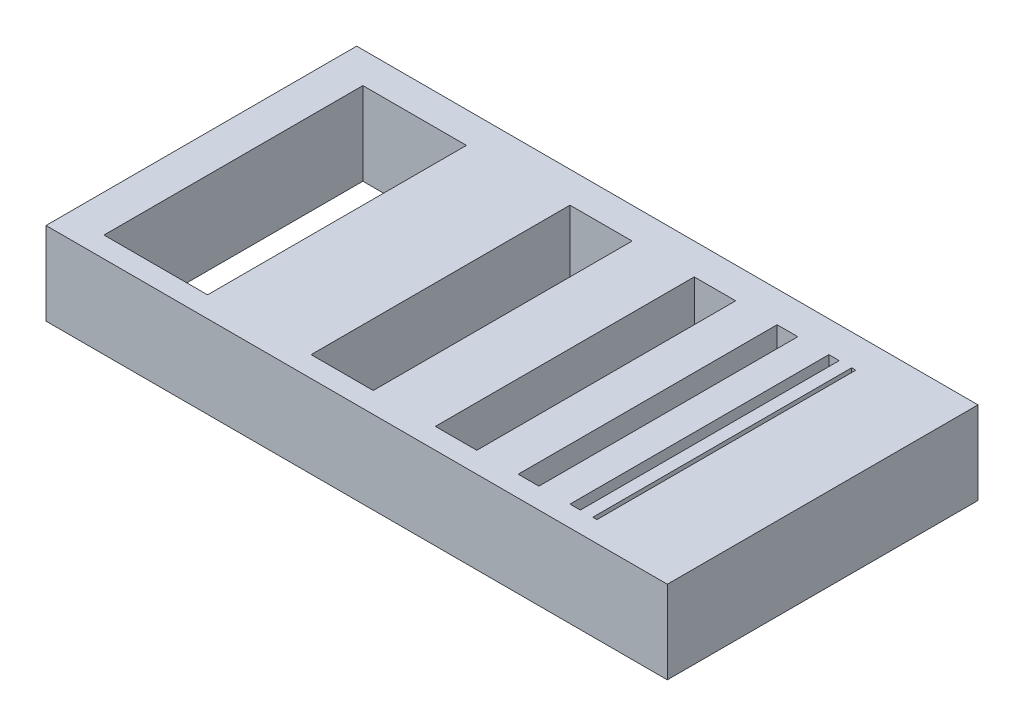
ISO-10303-21;
HEADER;
FILE_DESCRIPTION(('STEP AP214'),'2;1');
FILE_NAME('part.step','',(''),(''),'','','');
FILE_SCHEMA(('AUTOMOTIVE_DESIGN { 1 0 10303 214 1 1 1 1 }'));
ENDSEC;
DATA;
#1=APPLICATION_CONTEXT('core data for automotive mechanical design processes');
#2=APPLICATION_PROTOCOL_DEFINITION('international standard','automotive_design',2000,#1);
#3=PRODUCT_CONTEXT('',#1,'mechanical');
#4=PRODUCT('Part','Part','',(#3));
#5=PRODUCT_RELATED_PRODUCT_CATEGORY('part','',(#4));
#6=PRODUCT_DEFINITION_FORMATION('','',#4);
#7=PRODUCT_DEFINITION_CONTEXT('part definition',#1,'design');
#8=PRODUCT_DEFINITION('design','',#6,#7);
#9=PRODUCT_DEFINITION_SHAPE('','',#8);
#10=(LENGTH_UNIT() NAMED_UNIT(*) SI_UNIT(.MILLI.,.METRE.));
#11=(NAMED_UNIT(*) PLANE_ANGLE_UNIT() SI_UNIT($,.RADIAN.));
#12=(NAMED_UNIT(*) SI_UNIT($,.STERADIAN.) SOLID_ANGLE_UNIT());
#13=UNCERTAINTY_MEASURE_WITH_UNIT(LENGTH_MEASURE(1.E-05),#10,'distance_accuracy_value','');
#14=(GEOMETRIC_REPRESENTATION_CONTEXT(3) GLOBAL_UNCERTAINTY_ASSIGNED_CONTEXT((#13)) GLOBAL_UNIT_ASSIGNED_CONTEXT((#10,
#11,#12)) REPRESENTATION_CONTEXT('',''));
#15=CARTESIAN_POINT('',(0.,0.,0.));
#16=DIRECTION('',(0.,0.,1.));
#17=DIRECTION('',(1.,0.,0.));
#18=AXIS2_PLACEMENT_3D('',#15,#16,#17);
#19=CARTESIAN_POINT('',(0.,20.,0.));
#20=DIRECTION('',(0.,-1.,0.));
#21=DIRECTION('',(0.,0.,-1.));
#22=AXIS2_PLACEMENT_3D('',#19,#20,#21);
#23=PLANE('',#22);
#24=DIRECTION('',(0.,0.,1.));
#25=VECTOR('',#24,1.);
#26=CARTESIAN_POINT('',(121.5,20.,-67.5));
#27=LINE('',#26,#25);
#28=CARTESIAN_POINT('',(121.5,20.,-67.5));
#29=VERTEX_POINT('',#28);
#30=CARTESIAN_POINT('',(121.5,20.,-5.));
#31=VERTEX_POINT('',#30);
#32=EDGE_CURVE('E277',#29,#31,#27,.T.);
#33=ORIENTED_EDGE('',*,*,#32,.F.);
#34=DIRECTION('',(-1.,0.,0.));
#35=VECTOR('',#34,1.);
#36=CARTESIAN_POINT('',(121.5,20.,-67.5));
#37=LINE('',#36,#35);
#38=CARTESIAN_POINT('',(124.,20.,-67.5));
#39=VERTEX_POINT('',#38);
#40=EDGE_CURVE('E288',#39,#29,#37,.T.);
#41=ORIENTED_EDGE('',*,*,#40,.F.);
#42=DIRECTION('',(0.,0.,-1.));
#43=VECTOR('',#42,1.);
#44=CARTESIAN_POINT('',(124.,20.,-67.5));
#45=LINE('',#44,#43);
#46=CARTESIAN_POINT('',(124.,20.,-5.));
#47=VERTEX_POINT('',#46);
#48=EDGE_CURVE('E284',#47,#39,#45,.T.);
#49=ORIENTED_EDGE('',*,*,#48,.F.);
#50=DIRECTION('',(1.,0.,0.));
#51=VECTOR('',#50,1.);
#52=CARTESIAN_POINT('',(121.5,20.,-5.));
#53=LINE('',#52,#51);
#54=EDGE_CURVE('E280',#31,#47,#53,.T.);
#55=ORIENTED_EDGE('',*,*,#54,.F.);
#56=EDGE_LOOP('',(#33,#41,#49,#55));
#57=FACE_BOUND('',#56,.T.);
#58=DIRECTION('',(0.,0.,1.));
#59=VECTOR('',#58,1.);
#60=CARTESIAN_POINT('',(89.,20.,-67.5));
#61=LINE('',#60,#59);
#62=CARTESIAN_POINT('',(89.,20.,-67.5));
#63=VERTEX_POINT('',#62);
#64=CARTESIAN_POINT('',(89.,20.,-5.));
#65=VERTEX_POINT('',#64);
#66=EDGE_CURVE('E363',#63,#65,#61,.T.);
#67=ORIENTED_EDGE('',*,*,#66,.F.);
#68=DIRECTION('',(-1.,0.,0.));
#69=VECTOR('',#68,1.);
#70=CARTESIAN_POINT('',(89.,20.,-67.5));
#71=LINE('',#70,#69);
#72=CARTESIAN_POINT('',(99.,20.,-67.5));
#73=VERTEX_POINT('',#72);
#74=EDGE_CURVE('E374',#73,#63,#71,.T.);
#75=ORIENTED_EDGE('',*,*,#74,.F.);
#76=DIRECTION('',(0.,0.,-1.));
#77=VECTOR('',#76,1.);
#78=CARTESIAN_POINT('',(99.,20.,-67.5));
#79=LINE('',#78,#77);
#80=CARTESIAN_POINT('',(99.,20.,-5.));
#81=VERTEX_POINT('',#80);
#82=EDGE_CURVE('E370',#81,#73,#79,.T.);
#83=ORIENTED_EDGE('',*,*,#82,.F.);
#84=DIRECTION('',(1.,0.,0.));
#85=VECTOR('',#84,1.);
#86=CARTESIAN_POINT('',(89.,20.,-5.));
#87=LINE('',#86,#85);
#88=EDGE_CURVE('E366',#65,#81,#87,.T.);
#89=ORIENTED_EDGE('',*,*,#88,.F.);
#90=EDGE_LOOP('',(#67,#75,#83,#89));
#91=FACE_BOUND('',#90,.T.);
#92=DIRECTION('',(0.,0.,1.));
#93=VECTOR('',#92,1.);
#94=CARTESIAN_POINT('',(9.,20.,-67.5));
#95=LINE('',#94,#93);
#96=CARTESIAN_POINT('',(9.,20.,-67.5));
#97=VERTEX_POINT('',#96);
#98=CARTESIAN_POINT('',(9.00000000000001,20.,-5.));
#99=VERTEX_POINT('',#98);
#100=EDGE_CURVE('E449',#97,#99,#95,.T.);
#101=ORIENTED_EDGE('',*,*,#100,.F.);
#102=DIRECTION('',(-1.,0.,0.));
#103=VECTOR('',#102,1.);
#104=CARTESIAN_POINT('',(9.,20.,-67.5));
#105=LINE('',#104,#103);
#106=CARTESIAN_POINT('',(34.,20.,-67.5));
#107=VERTEX_POINT('',#106);
#108=EDGE_CURVE('E460',#107,#97,#105,.T.);
#109=ORIENTED_EDGE('',*,*,#108,.F.);
#110=DIRECTION('',(0.,0.,-1.));
#111=VECTOR('',#110,1.);
#112=CARTESIAN_POINT('',(34.,20.,-67.5));
#113=LINE('',#112,#111);
#114=CARTESIAN_POINT('',(34.,20.,-5.));
#115=VERTEX_POINT('',#114);
#116=EDGE_CURVE('E456',#115,#107,#113,.T.);
#117=ORIENTED_EDGE('',*,*,#116,.F.);
#118=DIRECTION('',(1.,0.,0.));
#119=VECTOR('',#118,1.);
#120=CARTESIAN_POINT('',(9.00000000000001,20.,-5.));
#121=LINE('',#120,#119);
#122=EDGE_CURVE('E452',#99,#115,#121,.T.);
#123=ORIENTED_EDGE('',*,*,#122,.F.);
#124=EDGE_LOOP('',(#101,#109,#117,#123));
#125=FACE_BOUND('',#124,.T.);
#126=DIRECTION('',(0.,0.,-1.));
#127=VECTOR('',#126,1.);
#128=CARTESIAN_POINT('',(150.,20.,0.));
#129=LINE('',#128,#127);
#130=CARTESIAN_POINT('',(150.,20.,0.));
#131=VERTEX_POINT('',#130);
#132=CARTESIAN_POINT('',(150.,20.,-75.));
#133=VERTEX_POINT('',#132);
#134=EDGE_CURVE('E492',#131,#133,#129,.T.);
#135=ORIENTED_EDGE('',*,*,#134,.T.);
#136=DIRECTION('',(-1.,0.,0.));
#137=VECTOR('',#136,1.);
#138=CARTESIAN_POINT('',(0.,20.,-75.));
#139=LINE('',#138,#137);
#140=CARTESIAN_POINT('',(0.,20.,-75.));
#141=VERTEX_POINT('',#140);
#142=EDGE_CURVE('E496',#133,#141,#139,.T.);
#143=ORIENTED_EDGE('',*,*,#142,.T.);
#144=DIRECTION('',(0.,0.,1.));
#145=VECTOR('',#144,1.);
#146=CARTESIAN_POINT('',(0.,20.,0.));
#147=LINE('',#146,#145);
#148=CARTESIAN_POINT('',(0.,20.,0.));
#149=VERTEX_POINT('',#148);
#150=EDGE_CURVE('E500',#141,#149,#147,.T.);
#151=ORIENTED_EDGE('',*,*,#150,.T.);
#152=DIRECTION('',(1.,0.,0.));
#153=VECTOR('',#152,1.);
#154=CARTESIAN_POINT('',(0.,20.,0.));
#155=LINE('',#154,#153);
#156=EDGE_CURVE('E503',#149,#131,#155,.T.);
#157=ORIENTED_EDGE('',*,*,#156,.T.);
#158=EDGE_LOOP('',(#135,#143,#151,#157));
#159=FACE_BOUND('',#158,.T.);
#160=DIRECTION('',(0.,0.,1.));
#161=VECTOR('',#160,1.);
#162=CARTESIAN_POINT('',(59.,20.,-67.5));
#163=LINE('',#162,#161);
#164=CARTESIAN_POINT('',(59.,20.,-67.5));
#165=VERTEX_POINT('',#164);
#166=CARTESIAN_POINT('',(59.,20.,-5.));
#167=VERTEX_POINT('',#166);
#168=EDGE_CURVE('E406',#165,#167,#163,.T.);
#169=ORIENTED_EDGE('',*,*,#168,.F.);
#170=DIRECTION('',(-1.,0.,0.));
#171=VECTOR('',#170,1.);
#172=CARTESIAN_POINT('',(59.,20.,-67.5));
#173=LINE('',#172,#171);
#174=CARTESIAN_POINT('',(74.,20.,-67.5));
#175=VERTEX_POINT('',#174);
#176=EDGE_CURVE('E417',#175,#165,#173,.T.);
#177=ORIENTED_EDGE('',*,*,#176,.F.);
#178=DIRECTION('',(0.,0.,-1.));
#179=VECTOR('',#178,1.);
#180=CARTESIAN_POINT('',(74.,20.,-67.5));
#181=LINE('',#180,#179);
#182=CARTESIAN_POINT('',(74.,20.,-5.));
#183=VERTEX_POINT('',#182);
#184=EDGE_CURVE('E413',#183,#175,#181,.T.);
#185=ORIENTED_EDGE('',*,*,#184,.F.);
#186=DIRECTION('',(1.,0.,0.));
#187=VECTOR('',#186,1.);
#188=CARTESIAN_POINT('',(59.,20.,-5.));
#189=LINE('',#188,#187);
#190=EDGE_CURVE('E409',#167,#183,#189,.T.);
#191=ORIENTED_EDGE('',*,*,#190,.F.);
#192=EDGE_LOOP('',(#169,#177,#185,#191));
#193=FACE_BOUND('',#192,.T.);
#194=DIRECTION('',(0.,0.,1.));
#195=VECTOR('',#194,1.);
#196=CARTESIAN_POINT('',(109.,20.,-67.5));
#197=LINE('',#196,#195);
#198=CARTESIAN_POINT('',(109.,20.,-67.5));
#199=VERTEX_POINT('',#198);
#200=CARTESIAN_POINT('',(109.,20.,-5.));
#201=VERTEX_POINT('',#200);
#202=EDGE_CURVE('E320',#199,#201,#197,.T.);
#203=ORIENTED_EDGE('',*,*,#202,.F.);
#204=DIRECTION('',(-1.,0.,0.));
#205=VECTOR('',#204,1.);
#206=CARTESIAN_POINT('',(109.,20.,-67.5));
#207=LINE('',#206,#205);
#208=CARTESIAN_POINT('',(114.,20.,-67.5));
#209=VERTEX_POINT('',#208);
#210=EDGE_CURVE('E331',#209,#199,#207,.T.);
#211=ORIENTED_EDGE('',*,*,#210,.F.);
#212=DIRECTION('',(0.,0.,-1.));
#213=VECTOR('',#212,1.);
#214=CARTESIAN_POINT('',(114.,20.,-67.5));
#215=LINE('',#214,#213);
#216=CARTESIAN_POINT('',(114.,20.,-5.));
#217=VERTEX_POINT('',#216);
#218=EDGE_CURVE('E327',#217,#209,#215,.T.);
#219=ORIENTED_EDGE('',*,*,#218,.F.);
#220=DIRECTION('',(1.,0.,0.));
#221=VECTOR('',#220,1.);
#222=CARTESIAN_POINT('',(109.,20.,-5.));
#223=LINE('',#222,#221);
#224=EDGE_CURVE('E323',#201,#217,#223,.T.);
#225=ORIENTED_EDGE('',*,*,#224,.F.);
#226=EDGE_LOOP('',(#203,#211,#219,#225));
#227=FACE_BOUND('',#226,.T.);
#228=DIRECTION('',(0.,0.,1.));
#229=VECTOR('',#228,1.);
#230=CARTESIAN_POINT('',(127.,20.,-67.5));
#231=LINE('',#230,#229);
#232=CARTESIAN_POINT('',(127.,20.,-67.5));
#233=VERTEX_POINT('',#232);
#234=CARTESIAN_POINT('',(127.,20.,-5.));
#235=VERTEX_POINT('',#234);
#236=EDGE_CURVE('E229',#233,#235,#231,.T.);
#237=ORIENTED_EDGE('',*,*,#236,.F.);
#238=DIRECTION('',(-1.,0.,0.));
#239=VECTOR('',#238,1.);
#240=CARTESIAN_POINT('',(127.,20.,-67.5));
#241=LINE('',#240,#239);
#242=CARTESIAN_POINT('',(128.,20.,-67.5));
#243=VERTEX_POINT('',#242);
#244=EDGE_CURVE('E255',#243,#233,#241,.T.);
#245=ORIENTED_EDGE('',*,*,#244,.F.);
#246=DIRECTION('',(0.,0.,-1.));
#247=VECTOR('',#246,1.);
#248=CARTESIAN_POINT('',(128.,20.,-67.5));
#249=LINE('',#248,#247);
#250=CARTESIAN_POINT('',(128.,20.,-5.));
#251=VERTEX_POINT('',#250);
#252=EDGE_CURVE('E251',#251,#243,#249,.T.);
#253=ORIENTED_EDGE('',*,*,#252,.F.);
#254=DIRECTION('',(1.,0.,0.));
#255=VECTOR('',#254,1.);
#256=CARTESIAN_POINT('',(127.,20.,-5.));
#257=LINE('',#256,#255);
#258=EDGE_CURVE('E238',#235,#251,#257,.T.);
#259=ORIENTED_EDGE('',*,*,#258,.F.);
#260=EDGE_LOOP('',(#237,#245,#253,#259));
#261=FACE_BOUND('',#260,.T.);
#262=ADVANCED_FACE('F43',(#57,#91,#125,#159,#193,#227,#261),#23,.F.);
#263=CARTESIAN_POINT('',(0.,0.,0.));
#264=DIRECTION('',(0.,-1.,0.));
#265=DIRECTION('',(0.,0.,-1.));
#266=AXIS2_PLACEMENT_3D('',#263,#264,#265);
#267=PLANE('',#266);
#268=DIRECTION('',(0.,0.,-1.));
#269=VECTOR('',#268,1.);
#270=CARTESIAN_POINT('',(150.,0.,0.));
#271=LINE('',#270,#269);
#272=CARTESIAN_POINT('',(150.,0.,0.));
#273=VERTEX_POINT('',#272);
#274=CARTESIAN_POINT('',(150.,0.,-75.));
#275=VERTEX_POINT('',#274);
#276=EDGE_CURVE('E491',#273,#275,#271,.T.);
#277=ORIENTED_EDGE('',*,*,#276,.F.);
#278=DIRECTION('',(1.,0.,0.));
#279=VECTOR('',#278,1.);
#280=CARTESIAN_POINT('',(0.,0.,0.));
#281=LINE('',#280,#279);
#282=CARTESIAN_POINT('',(0.,0.,0.));
#283=VERTEX_POINT('',#282);
#284=EDGE_CURVE('E497',#283,#273,#281,.T.);
#285=ORIENTED_EDGE('',*,*,#284,.F.);
#286=DIRECTION('',(0.,0.,1.));
#287=VECTOR('',#286,1.);
#288=CARTESIAN_POINT('',(0.,0.,0.));
#289=LINE('',#288,#287);
#290=CARTESIAN_POINT('',(0.,0.,-75.));
#291=VERTEX_POINT('',#290);
#292=EDGE_CURVE('E513',#291,#283,#289,.T.);
#293=ORIENTED_EDGE('',*,*,#292,.F.);
#294=DIRECTION('',(-1.,0.,0.));
#295=VECTOR('',#294,1.);
#296=CARTESIAN_POINT('',(0.,0.,-75.));
#297=LINE('',#296,#295);
#298=EDGE_CURVE('E510',#275,#291,#297,.T.);
#299=ORIENTED_EDGE('',*,*,#298,.F.);
#300=EDGE_LOOP('',(#277,#285,#293,#299));
#301=FACE_BOUND('',#300,.T.);
#302=DIRECTION('',(-1.,0.,0.));
#303=VECTOR('',#302,1.);
#304=CARTESIAN_POINT('',(9.,0.,-67.5));
#305=LINE('',#304,#303);
#306=CARTESIAN_POINT('',(34.,0.,-67.5));
#307=VERTEX_POINT('',#306);
#308=CARTESIAN_POINT('',(9.,0.,-67.5));
#309=VERTEX_POINT('',#308);
#310=EDGE_CURVE('E453',#307,#309,#305,.T.);
#311=ORIENTED_EDGE('',*,*,#310,.T.);
#312=DIRECTION('',(0.,0.,1.));
#313=VECTOR('',#312,1.);
#314=CARTESIAN_POINT('',(9.,0.,-67.5));
#315=LINE('',#314,#313);
#316=CARTESIAN_POINT('',(9.00000000000001,0.,-5.));
#317=VERTEX_POINT('',#316);
#318=EDGE_CURVE('E448',#309,#317,#315,.T.);
#319=ORIENTED_EDGE('',*,*,#318,.T.);
#320=DIRECTION('',(1.,0.,0.));
#321=VECTOR('',#320,1.);
#322=CARTESIAN_POINT('',(9.00000000000001,0.,-5.));
#323=LINE('',#322,#321);
#324=CARTESIAN_POINT('',(34.,0.,-5.));
#325=VERTEX_POINT('',#324);
#326=EDGE_CURVE('E467',#317,#325,#323,.T.);
#327=ORIENTED_EDGE('',*,*,#326,.T.);
#328=DIRECTION('',(0.,0.,-1.));
#329=VECTOR('',#328,1.);
#330=CARTESIAN_POINT('',(34.,0.,-67.5));
#331=LINE('',#330,#329);
#332=EDGE_CURVE('E471',#325,#307,#331,.T.);
#333=ORIENTED_EDGE('',*,*,#332,.T.);
#334=EDGE_LOOP('',(#311,#319,#327,#333));
#335=FACE_BOUND('',#334,.T.);
#336=DIRECTION('',(-1.,0.,0.));
#337=VECTOR('',#336,1.);
#338=CARTESIAN_POINT('',(59.,0.,-67.5));
#339=LINE('',#338,#337);
#340=CARTESIAN_POINT('',(74.,0.,-67.5));
#341=VERTEX_POINT('',#340);
#342=CARTESIAN_POINT('',(59.,0.,-67.5));
#343=VERTEX_POINT('',#342);
#344=EDGE_CURVE('E410',#341,#343,#339,.T.);
#345=ORIENTED_EDGE('',*,*,#344,.T.);
#346=DIRECTION('',(0.,0.,1.));
#347=VECTOR('',#346,1.);
#348=CARTESIAN_POINT('',(59.,0.,-67.5));
#349=LINE('',#348,#347);
#350=CARTESIAN_POINT('',(59.,0.,-5.));
#351=VERTEX_POINT('',#350);
#352=EDGE_CURVE('E405',#343,#351,#349,.T.);
#353=ORIENTED_EDGE('',*,*,#352,.T.);
#354=DIRECTION('',(1.,0.,0.));
#355=VECTOR('',#354,1.);
#356=CARTESIAN_POINT('',(59.,0.,-5.));
#357=LINE('',#356,#355);
#358=CARTESIAN_POINT('',(74.,0.,-5.));
#359=VERTEX_POINT('',#358);
#360=EDGE_CURVE('E424',#351,#359,#357,.T.);
#361=ORIENTED_EDGE('',*,*,#360,.T.);
#362=DIRECTION('',(0.,0.,-1.));
#363=VECTOR('',#362,1.);
#364=CARTESIAN_POINT('',(74.,0.,-67.5));
#365=LINE('',#364,#363);
#366=EDGE_CURVE('E428',#359,#341,#365,.T.);
#367=ORIENTED_EDGE('',*,*,#366,.T.);
#368=EDGE_LOOP('',(#345,#353,#361,#367));
#369=FACE_BOUND('',#368,.T.);
#370=DIRECTION('',(-1.,0.,0.));
#371=VECTOR('',#370,1.);
#372=CARTESIAN_POINT('',(89.,0.,-67.5));
#373=LINE('',#372,#371);
#374=CARTESIAN_POINT('',(99.,0.,-67.5));
#375=VERTEX_POINT('',#374);
#376=CARTESIAN_POINT('',(89.,0.,-67.5));
#377=VERTEX_POINT('',#376);
#378=EDGE_CURVE('E367',#375,#377,#373,.T.);
#379=ORIENTED_EDGE('',*,*,#378,.T.);
#380=DIRECTION('',(0.,0.,1.));
#381=VECTOR('',#380,1.);
#382=CARTESIAN_POINT('',(89.,0.,-67.5));
#383=LINE('',#382,#381);
#384=CARTESIAN_POINT('',(89.,0.,-5.));
#385=VERTEX_POINT('',#384);
#386=EDGE_CURVE('E362',#377,#385,#383,.T.);
#387=ORIENTED_EDGE('',*,*,#386,.T.);
#388=DIRECTION('',(1.,0.,0.));
#389=VECTOR('',#388,1.);
#390=CARTESIAN_POINT('',(89.,0.,-5.));
#391=LINE('',#390,#389);
#392=CARTESIAN_POINT('',(99.,0.,-5.));
#393=VERTEX_POINT('',#392);
#394=EDGE_CURVE('E381',#385,#393,#391,.T.);
#395=ORIENTED_EDGE('',*,*,#394,.T.);
#396=DIRECTION('',(0.,0.,-1.));
#397=VECTOR('',#396,1.);
#398=CARTESIAN_POINT('',(99.,0.,-67.5));
#399=LINE('',#398,#397);
#400=EDGE_CURVE('E385',#393,#375,#399,.T.);
#401=ORIENTED_EDGE('',*,*,#400,.T.);
#402=EDGE_LOOP('',(#379,#387,#395,#401));
#403=FACE_BOUND('',#402,.T.);
#404=DIRECTION('',(-1.,0.,0.));
#405=VECTOR('',#404,1.);
#406=CARTESIAN_POINT('',(109.,0.,-67.5));
#407=LINE('',#406,#405);
#408=CARTESIAN_POINT('',(114.,0.,-67.5));
#409=VERTEX_POINT('',#408);
#410=CARTESIAN_POINT('',(109.,0.,-67.5));
#411=VERTEX_POINT('',#410);
#412=EDGE_CURVE('E324',#409,#411,#407,.T.);
#413=ORIENTED_EDGE('',*,*,#412,.T.);
#414=DIRECTION('',(0.,0.,1.));
#415=VECTOR('',#414,1.);
#416=CARTESIAN_POINT('',(109.,0.,-67.5));
#417=LINE('',#416,#415);
#418=CARTESIAN_POINT('',(109.,0.,-5.));
#419=VERTEX_POINT('',#418);
#420=EDGE_CURVE('E319',#411,#419,#417,.T.);
#421=ORIENTED_EDGE('',*,*,#420,.T.);
#422=DIRECTION('',(1.,0.,0.));
#423=VECTOR('',#422,1.);
#424=CARTESIAN_POINT('',(109.,0.,-5.));
#425=LINE('',#424,#423);
#426=CARTESIAN_POINT('',(114.,0.,-5.));
#427=VERTEX_POINT('',#426);
#428=EDGE_CURVE('E338',#419,#427,#425,.T.);
#429=ORIENTED_EDGE('',*,*,#428,.T.);
#430=DIRECTION('',(0.,0.,-1.));
#431=VECTOR('',#430,1.);
#432=CARTESIAN_POINT('',(114.,0.,-67.5));
#433=LINE('',#432,#431);
#434=EDGE_CURVE('E342',#427,#409,#433,.T.);
#435=ORIENTED_EDGE('',*,*,#434,.T.);
#436=EDGE_LOOP('',(#413,#421,#429,#435));
#437=FACE_BOUND('',#436,.T.);
#438=DIRECTION('',(-1.,0.,0.));
#439=VECTOR('',#438,1.);
#440=CARTESIAN_POINT('',(121.5,0.,-67.5));
#441=LINE('',#440,#439);
#442=CARTESIAN_POINT('',(124.,0.,-67.5));
#443=VERTEX_POINT('',#442);
#444=CARTESIAN_POINT('',(121.5,0.,-67.5));
#445=VERTEX_POINT('',#444);
#446=EDGE_CURVE('E281',#443,#445,#441,.T.);
#447=ORIENTED_EDGE('',*,*,#446,.T.);
#448=DIRECTION('',(0.,0.,1.));
#449=VECTOR('',#448,1.);
#450=CARTESIAN_POINT('',(121.5,0.,-67.5));
#451=LINE('',#450,#449);
#452=CARTESIAN_POINT('',(121.5,0.,-5.));
#453=VERTEX_POINT('',#452);
#454=EDGE_CURVE('E247',#445,#453,#451,.T.);
#455=ORIENTED_EDGE('',*,*,#454,.T.);
#456=DIRECTION('',(1.,0.,0.));
#457=VECTOR('',#456,1.);
#458=CARTESIAN_POINT('',(121.5,0.,-5.));
#459=LINE('',#458,#457);
#460=CARTESIAN_POINT('',(124.,0.,-5.));
#461=VERTEX_POINT('',#460);
#462=EDGE_CURVE('E295',#453,#461,#459,.T.);
#463=ORIENTED_EDGE('',*,*,#462,.T.);
#464=DIRECTION('',(0.,0.,-1.));
#465=VECTOR('',#464,1.);
#466=CARTESIAN_POINT('',(124.,0.,-67.5));
#467=LINE('',#466,#465);
#468=EDGE_CURVE('E299',#461,#443,#467,.T.);
#469=ORIENTED_EDGE('',*,*,#468,.T.);
#470=EDGE_LOOP('',(#447,#455,#463,#469));
#471=FACE_BOUND('',#470,.T.);
#472=DIRECTION('',(-1.,0.,0.));
#473=VECTOR('',#472,1.);
#474=CARTESIAN_POINT('',(127.,0.,-67.5));
#475=LINE('',#474,#473);
#476=CARTESIAN_POINT('',(128.,0.,-67.5));
#477=VERTEX_POINT('',#476);
#478=CARTESIAN_POINT('',(127.,0.,-67.5));
#479=VERTEX_POINT('',#478);
#480=EDGE_CURVE('E239',#477,#479,#475,.T.);
#481=ORIENTED_EDGE('',*,*,#480,.T.);
#482=DIRECTION('',(0.,0.,1.));
#483=VECTOR('',#482,1.);
#484=CARTESIAN_POINT('',(127.,0.,-67.5));
#485=LINE('',#484,#483);
#486=CARTESIAN_POINT('',(127.,0.,-5.));
#487=VERTEX_POINT('',#486);
#488=EDGE_CURVE('E67',#479,#487,#485,.T.);
#489=ORIENTED_EDGE('',*,*,#488,.T.);
#490=DIRECTION('',(1.,0.,0.));
#491=VECTOR('',#490,1.);
#492=CARTESIAN_POINT('',(127.,0.,-5.));
#493=LINE('',#492,#491);
#494=CARTESIAN_POINT('',(128.,0.,-5.));
#495=VERTEX_POINT('',#494);
#496=EDGE_CURVE('E245',#487,#495,#493,.T.);
#497=ORIENTED_EDGE('',*,*,#496,.T.);
#498=DIRECTION('',(0.,0.,-1.));
#499=VECTOR('',#498,1.);
#500=CARTESIAN_POINT('',(128.,0.,-67.5));
#501=LINE('',#500,#499);
#502=EDGE_CURVE('E264',#495,#477,#501,.T.);
#503=ORIENTED_EDGE('',*,*,#502,.T.);
#504=EDGE_LOOP('',(#481,#489,#497,#503));
#505=FACE_BOUND('',#504,.T.);
#506=ADVANCED_FACE('F536',(#301,#335,#369,#403,#437,#471,#505),#267,.T.);
#507=CARTESIAN_POINT('',(150.,20.,0.));
#508=DIRECTION('',(-1.,0.,0.));
#509=DIRECTION('',(0.,0.,1.));
#510=AXIS2_PLACEMENT_3D('',#507,#508,#509);
#511=PLANE('',#510);
#512=ORIENTED_EDGE('',*,*,#276,.T.);
#513=DIRECTION('',(0.,-1.,0.));
#514=VECTOR('',#513,1.);
#515=CARTESIAN_POINT('',(150.,20.,-75.));
#516=LINE('',#515,#514);
#517=EDGE_CURVE('E11',#133,#275,#516,.T.);
#518=ORIENTED_EDGE('',*,*,#517,.F.);
#519=ORIENTED_EDGE('',*,*,#134,.F.);
#520=DIRECTION('',(0.,-1.,0.));
#521=VECTOR('',#520,1.);
#522=CARTESIAN_POINT('',(150.,20.,0.));
#523=LINE('',#522,#521);
#524=EDGE_CURVE('E506',#131,#273,#523,.T.);
#525=ORIENTED_EDGE('',*,*,#524,.T.);
#526=EDGE_LOOP('',(#512,#518,#519,#525));
#527=FACE_BOUND('',#526,.T.);
#528=ADVANCED_FACE('F45',(#527),#511,.F.);
#529=CARTESIAN_POINT('',(0.,20.,-75.));
#530=DIRECTION('',(0.,0.,1.));
#531=DIRECTION('',(1.,0.,0.));
#532=AXIS2_PLACEMENT_3D('',#529,#530,#531);
#533=PLANE('',#532);
#534=ORIENTED_EDGE('',*,*,#298,.T.);
#535=DIRECTION('',(0.,-1.,0.));
#536=VECTOR('',#535,1.);
#537=CARTESIAN_POINT('',(0.,20.,-75.));
#538=LINE('',#537,#536);
#539=EDGE_CURVE('E52',#141,#291,#538,.T.);
#540=ORIENTED_EDGE('',*,*,#539,.F.);
#541=ORIENTED_EDGE('',*,*,#142,.F.);
#542=ORIENTED_EDGE('',*,*,#517,.T.);
#543=EDGE_LOOP('',(#534,#540,#541,#542));
#544=FACE_BOUND('',#543,.T.);
#545=ADVANCED_FACE('F547',(#544),#533,.F.);
#546=CARTESIAN_POINT('',(0.,20.,0.));
#547=DIRECTION('',(1.,0.,0.));
#548=DIRECTION('',(0.,0.,-1.));
#549=AXIS2_PLACEMENT_3D('',#546,#547,#548);
#550=PLANE('',#549);
#551=ORIENTED_EDGE('',*,*,#292,.T.);
#552=DIRECTION('',(0.,-1.,0.));
#553=VECTOR('',#552,1.);
#554=CARTESIAN_POINT('',(0.,20.,0.));
#555=LINE('',#554,#553);
#556=EDGE_CURVE('E521',#149,#283,#555,.T.);
#557=ORIENTED_EDGE('',*,*,#556,.F.);
#558=ORIENTED_EDGE('',*,*,#150,.F.);
#559=ORIENTED_EDGE('',*,*,#539,.T.);
#560=EDGE_LOOP('',(#551,#557,#558,#559));
#561=FACE_BOUND('',#560,.T.);
#562=ADVANCED_FACE('F530',(#561),#550,.F.);
#563=CARTESIAN_POINT('',(0.,20.,0.));
#564=DIRECTION('',(0.,0.,-1.));
#565=DIRECTION('',(-1.,0.,0.));
#566=AXIS2_PLACEMENT_3D('',#563,#564,#565);
#567=PLANE('',#566);
#568=ORIENTED_EDGE('',*,*,#284,.T.);
#569=ORIENTED_EDGE('',*,*,#524,.F.);
#570=ORIENTED_EDGE('',*,*,#156,.F.);
#571=ORIENTED_EDGE('',*,*,#556,.T.);
#572=EDGE_LOOP('',(#568,#569,#570,#571));
#573=FACE_BOUND('',#572,.T.);
#574=ADVANCED_FACE('F540',(#573),#567,.F.);
#575=CARTESIAN_POINT('',(9.,20.,-67.5));
#576=DIRECTION('',(1.,0.,0.));
#577=DIRECTION('',(0.,0.,-1.));
#578=AXIS2_PLACEMENT_3D('',#575,#576,#577);
#579=PLANE('',#578);
#580=ORIENTED_EDGE('',*,*,#318,.F.);
#581=DIRECTION('',(0.,-1.,0.));
#582=VECTOR('',#581,1.);
#583=CARTESIAN_POINT('',(9.,20.,-67.5));
#584=LINE('',#583,#582);
#585=EDGE_CURVE('E463',#97,#309,#584,.T.);
#586=ORIENTED_EDGE('',*,*,#585,.F.);
#587=ORIENTED_EDGE('',*,*,#100,.T.);
#588=DIRECTION('',(0.,-1.,0.));
#589=VECTOR('',#588,1.);
#590=CARTESIAN_POINT('',(9.00000000000001,20.,-5.));
#591=LINE('',#590,#589);
#592=EDGE_CURVE('E487',#99,#317,#591,.T.);
#593=ORIENTED_EDGE('',*,*,#592,.T.);
#594=EDGE_LOOP('',(#580,#586,#587,#593));
#595=FACE_BOUND('',#594,.T.);
#596=ADVANCED_FACE('F564',(#595),#579,.T.);
#597=CARTESIAN_POINT('',(9.00000000000001,20.,-5.));
#598=DIRECTION('',(0.,0.,-1.));
#599=DIRECTION('',(-1.,0.,0.));
#600=AXIS2_PLACEMENT_3D('',#597,#598,#599);
#601=PLANE('',#600);
#602=ORIENTED_EDGE('',*,*,#326,.F.);
#603=ORIENTED_EDGE('',*,*,#592,.F.);
#604=ORIENTED_EDGE('',*,*,#122,.T.);
#605=DIRECTION('',(0.,-1.,0.));
#606=VECTOR('',#605,1.);
#607=CARTESIAN_POINT('',(34.,20.,-5.));
#608=LINE('',#607,#606);
#609=EDGE_CURVE('E484',#115,#325,#608,.T.);
#610=ORIENTED_EDGE('',*,*,#609,.T.);
#611=EDGE_LOOP('',(#602,#603,#604,#610));
#612=FACE_BOUND('',#611,.T.);
#613=ADVANCED_FACE('F571',(#612),#601,.T.);
#614=CARTESIAN_POINT('',(34.,20.,-67.5));
#615=DIRECTION('',(-1.,0.,0.));
#616=DIRECTION('',(0.,0.,1.));
#617=AXIS2_PLACEMENT_3D('',#614,#615,#616);
#618=PLANE('',#617);
#619=ORIENTED_EDGE('',*,*,#332,.F.);
#620=ORIENTED_EDGE('',*,*,#609,.F.);
#621=ORIENTED_EDGE('',*,*,#116,.T.);
#622=DIRECTION('',(0.,-1.,0.));
#623=VECTOR('',#622,1.);
#624=CARTESIAN_POINT('',(34.,20.,-67.5));
#625=LINE('',#624,#623);
#626=EDGE_CURVE('E481',#107,#307,#625,.T.);
#627=ORIENTED_EDGE('',*,*,#626,.T.);
#628=EDGE_LOOP('',(#619,#620,#621,#627));
#629=FACE_BOUND('',#628,.T.);
#630=ADVANCED_FACE('F576',(#629),#618,.T.);
#631=CARTESIAN_POINT('',(9.,20.,-67.5));
#632=DIRECTION('',(0.,0.,1.));
#633=DIRECTION('',(1.,0.,0.));
#634=AXIS2_PLACEMENT_3D('',#631,#632,#633);
#635=PLANE('',#634);
#636=ORIENTED_EDGE('',*,*,#310,.F.);
#637=ORIENTED_EDGE('',*,*,#626,.F.);
#638=ORIENTED_EDGE('',*,*,#108,.T.);
#639=ORIENTED_EDGE('',*,*,#585,.T.);
#640=EDGE_LOOP('',(#636,#637,#638,#639));
#641=FACE_BOUND('',#640,.T.);
#642=ADVANCED_FACE('F583',(#641),#635,.T.);
#643=CARTESIAN_POINT('',(59.,20.,-67.5));
#644=DIRECTION('',(1.,0.,0.));
#645=DIRECTION('',(0.,0.,-1.));
#646=AXIS2_PLACEMENT_3D('',#643,#644,#645);
#647=PLANE('',#646);
#648=ORIENTED_EDGE('',*,*,#352,.F.);
#649=DIRECTION('',(0.,-1.,0.));
#650=VECTOR('',#649,1.);
#651=CARTESIAN_POINT('',(59.,20.,-67.5));
#652=LINE('',#651,#650);
#653=EDGE_CURVE('E420',#165,#343,#652,.T.);
#654=ORIENTED_EDGE('',*,*,#653,.F.);
#655=ORIENTED_EDGE('',*,*,#168,.T.);
#656=DIRECTION('',(0.,-1.,0.));
#657=VECTOR('',#656,1.);
#658=CARTESIAN_POINT('',(59.,20.,-5.));
#659=LINE('',#658,#657);
#660=EDGE_CURVE('E444',#167,#351,#659,.T.);
#661=ORIENTED_EDGE('',*,*,#660,.T.);
#662=EDGE_LOOP('',(#648,#654,#655,#661));
#663=FACE_BOUND('',#662,.T.);
#664=ADVANCED_FACE('F597',(#663),#647,.T.);
#665=CARTESIAN_POINT('',(59.,20.,-5.));
#666=DIRECTION('',(0.,0.,-1.));
#667=DIRECTION('',(-1.,0.,0.));
#668=AXIS2_PLACEMENT_3D('',#665,#666,#667);
#669=PLANE('',#668);
#670=ORIENTED_EDGE('',*,*,#360,.F.);
#671=ORIENTED_EDGE('',*,*,#660,.F.);
#672=ORIENTED_EDGE('',*,*,#190,.T.);
#673=DIRECTION('',(0.,-1.,0.));
#674=VECTOR('',#673,1.);
#675=CARTESIAN_POINT('',(74.,20.,-5.));
#676=LINE('',#675,#674);
#677=EDGE_CURVE('E441',#183,#359,#676,.T.);
#678=ORIENTED_EDGE('',*,*,#677,.T.);
#679=EDGE_LOOP('',(#670,#671,#672,#678));
#680=FACE_BOUND('',#679,.T.);
#681=ADVANCED_FACE('F602',(#680),#669,.T.);
#682=CARTESIAN_POINT('',(74.,20.,-67.5));
#683=DIRECTION('',(-1.,0.,0.));
#684=DIRECTION('',(0.,0.,1.));
#685=AXIS2_PLACEMENT_3D('',#682,#683,#684);
#686=PLANE('',#685);
#687=ORIENTED_EDGE('',*,*,#366,.F.);
#688=ORIENTED_EDGE('',*,*,#677,.F.);
#689=ORIENTED_EDGE('',*,*,#184,.T.);
#690=DIRECTION('',(0.,-1.,0.));
#691=VECTOR('',#690,1.);
#692=CARTESIAN_POINT('',(74.,20.,-67.5));
#693=LINE('',#692,#691);
#694=EDGE_CURVE('E438',#175,#341,#693,.T.);
#695=ORIENTED_EDGE('',*,*,#694,.T.);
#696=EDGE_LOOP('',(#687,#688,#689,#695));
#697=FACE_BOUND('',#696,.T.);
#698=ADVANCED_FACE('F606',(#697),#686,.T.);
#699=CARTESIAN_POINT('',(59.,20.,-67.5));
#700=DIRECTION('',(0.,0.,1.));
#701=DIRECTION('',(1.,0.,0.));
#702=AXIS2_PLACEMENT_3D('',#699,#700,#701);
#703=PLANE('',#702);
#704=ORIENTED_EDGE('',*,*,#344,.F.);
#705=ORIENTED_EDGE('',*,*,#694,.F.);
#706=ORIENTED_EDGE('',*,*,#176,.T.);
#707=ORIENTED_EDGE('',*,*,#653,.T.);
#708=EDGE_LOOP('',(#704,#705,#706,#707));
#709=FACE_BOUND('',#708,.T.);
#710=ADVANCED_FACE('F610',(#709),#703,.T.);
#711=CARTESIAN_POINT('',(89.,20.,-67.5));
#712=DIRECTION('',(1.,0.,0.));
#713=DIRECTION('',(0.,0.,-1.));
#714=AXIS2_PLACEMENT_3D('',#711,#712,#713);
#715=PLANE('',#714);
#716=ORIENTED_EDGE('',*,*,#386,.F.);
#717=DIRECTION('',(0.,-1.,0.));
#718=VECTOR('',#717,1.);
#719=CARTESIAN_POINT('',(89.,20.,-67.5));
#720=LINE('',#719,#718);
#721=EDGE_CURVE('E377',#63,#377,#720,.T.);
#722=ORIENTED_EDGE('',*,*,#721,.F.);
#723=ORIENTED_EDGE('',*,*,#66,.T.);
#724=DIRECTION('',(0.,-1.,0.));
#725=VECTOR('',#724,1.);
#726=CARTESIAN_POINT('',(89.,20.,-5.));
#727=LINE('',#726,#725);
#728=EDGE_CURVE('E401',#65,#385,#727,.T.);
#729=ORIENTED_EDGE('',*,*,#728,.T.);
#730=EDGE_LOOP('',(#716,#722,#723,#729));
#731=FACE_BOUND('',#730,.T.);
#732=ADVANCED_FACE('F614',(#731),#715,.T.);
#733=CARTESIAN_POINT('',(89.,20.,-5.));
#734=DIRECTION('',(0.,0.,-1.));
#735=DIRECTION('',(-1.,0.,0.));
#736=AXIS2_PLACEMENT_3D('',#733,#734,#735);
#737=PLANE('',#736);
#738=ORIENTED_EDGE('',*,*,#394,.F.);
#739=ORIENTED_EDGE('',*,*,#728,.F.);
#740=ORIENTED_EDGE('',*,*,#88,.T.);
#741=DIRECTION('',(0.,-1.,0.));
#742=VECTOR('',#741,1.);
#743=CARTESIAN_POINT('',(99.,20.,-5.));
#744=LINE('',#743,#742);
#745=EDGE_CURVE('E398',#81,#393,#744,.T.);
#746=ORIENTED_EDGE('',*,*,#745,.T.);
#747=EDGE_LOOP('',(#738,#739,#740,#746));
#748=FACE_BOUND('',#747,.T.);
#749=ADVANCED_FACE('F618',(#748),#737,.T.);
#750=CARTESIAN_POINT('',(99.,20.,-67.5));
#751=DIRECTION('',(-1.,0.,0.));
#752=DIRECTION('',(0.,0.,1.));
#753=AXIS2_PLACEMENT_3D('',#750,#751,#752);
#754=PLANE('',#753);
#755=ORIENTED_EDGE('',*,*,#400,.F.);
#756=ORIENTED_EDGE('',*,*,#745,.F.);
#757=ORIENTED_EDGE('',*,*,#82,.T.);
#758=DIRECTION('',(0.,-1.,0.));
#759=VECTOR('',#758,1.);
#760=CARTESIAN_POINT('',(99.,20.,-67.5));
#761=LINE('',#760,#759);
#762=EDGE_CURVE('E395',#73,#375,#761,.T.);
#763=ORIENTED_EDGE('',*,*,#762,.T.);
#764=EDGE_LOOP('',(#755,#756,#757,#763));
#765=FACE_BOUND('',#764,.T.);
#766=ADVANCED_FACE('F622',(#765),#754,.T.);
#767=CARTESIAN_POINT('',(89.,20.,-67.5));
#768=DIRECTION('',(0.,0.,1.));
#769=DIRECTION('',(1.,0.,0.));
#770=AXIS2_PLACEMENT_3D('',#767,#768,#769);
#771=PLANE('',#770);
#772=ORIENTED_EDGE('',*,*,#378,.F.);
#773=ORIENTED_EDGE('',*,*,#762,.F.);
#774=ORIENTED_EDGE('',*,*,#74,.T.);
#775=ORIENTED_EDGE('',*,*,#721,.T.);
#776=EDGE_LOOP('',(#772,#773,#774,#775));
#777=FACE_BOUND('',#776,.T.);
#778=ADVANCED_FACE('F626',(#777),#771,.T.);
#779=CARTESIAN_POINT('',(109.,20.,-67.5));
#780=DIRECTION('',(1.,0.,0.));
#781=DIRECTION('',(0.,0.,-1.));
#782=AXIS2_PLACEMENT_3D('',#779,#780,#781);
#783=PLANE('',#782);
#784=ORIENTED_EDGE('',*,*,#420,.F.);
#785=DIRECTION('',(0.,-1.,0.));
#786=VECTOR('',#785,1.);
#787=CARTESIAN_POINT('',(109.,20.,-67.5));
#788=LINE('',#787,#786);
#789=EDGE_CURVE('E334',#199,#411,#788,.T.);
#790=ORIENTED_EDGE('',*,*,#789,.F.);
#791=ORIENTED_EDGE('',*,*,#202,.T.);
#792=DIRECTION('',(0.,-1.,0.));
#793=VECTOR('',#792,1.);
#794=CARTESIAN_POINT('',(109.,20.,-5.));
#795=LINE('',#794,#793);
#796=EDGE_CURVE('E358',#201,#419,#795,.T.);
#797=ORIENTED_EDGE('',*,*,#796,.T.);
#798=EDGE_LOOP('',(#784,#790,#791,#797));
#799=FACE_BOUND('',#798,.T.);
#800=ADVANCED_FACE('F630',(#799),#783,.T.);
#801=CARTESIAN_POINT('',(109.,20.,-5.));
#802=DIRECTION('',(0.,0.,-1.));
#803=DIRECTION('',(-1.,0.,0.));
#804=AXIS2_PLACEMENT_3D('',#801,#802,#803);
#805=PLANE('',#804);
#806=ORIENTED_EDGE('',*,*,#428,.F.);
#807=ORIENTED_EDGE('',*,*,#796,.F.);
#808=ORIENTED_EDGE('',*,*,#224,.T.);
#809=DIRECTION('',(0.,-1.,0.));
#810=VECTOR('',#809,1.);
#811=CARTESIAN_POINT('',(114.,20.,-5.));
#812=LINE('',#811,#810);
#813=EDGE_CURVE('E355',#217,#427,#812,.T.);
#814=ORIENTED_EDGE('',*,*,#813,.T.);
#815=EDGE_LOOP('',(#806,#807,#808,#814));
#816=FACE_BOUND('',#815,.T.);
#817=ADVANCED_FACE('F634',(#816),#805,.T.);
#818=CARTESIAN_POINT('',(114.,20.,-67.5));
#819=DIRECTION('',(-1.,0.,0.));
#820=DIRECTION('',(0.,0.,1.));
#821=AXIS2_PLACEMENT_3D('',#818,#819,#820);
#822=PLANE('',#821);
#823=ORIENTED_EDGE('',*,*,#434,.F.);
#824=ORIENTED_EDGE('',*,*,#813,.F.);
#825=ORIENTED_EDGE('',*,*,#218,.T.);
#826=DIRECTION('',(0.,-1.,0.));
#827=VECTOR('',#826,1.);
#828=CARTESIAN_POINT('',(114.,20.,-67.5));
#829=LINE('',#828,#827);
#830=EDGE_CURVE('E352',#209,#409,#829,.T.);
#831=ORIENTED_EDGE('',*,*,#830,.T.);
#832=EDGE_LOOP('',(#823,#824,#825,#831));
#833=FACE_BOUND('',#832,.T.);
#834=ADVANCED_FACE('F638',(#833),#822,.T.);
#835=CARTESIAN_POINT('',(109.,20.,-67.5));
#836=DIRECTION('',(0.,0.,1.));
#837=DIRECTION('',(1.,0.,0.));
#838=AXIS2_PLACEMENT_3D('',#835,#836,#837);
#839=PLANE('',#838);
#840=ORIENTED_EDGE('',*,*,#412,.F.);
#841=ORIENTED_EDGE('',*,*,#830,.F.);
#842=ORIENTED_EDGE('',*,*,#210,.T.);
#843=ORIENTED_EDGE('',*,*,#789,.T.);
#844=EDGE_LOOP('',(#840,#841,#842,#843));
#845=FACE_BOUND('',#844,.T.);
#846=ADVANCED_FACE('F642',(#845),#839,.T.);
#847=CARTESIAN_POINT('',(121.5,20.,-67.5));
#848=DIRECTION('',(1.,0.,0.));
#849=DIRECTION('',(0.,0.,-1.));
#850=AXIS2_PLACEMENT_3D('',#847,#848,#849);
#851=PLANE('',#850);
#852=ORIENTED_EDGE('',*,*,#454,.F.);
#853=DIRECTION('',(0.,-1.,0.));
#854=VECTOR('',#853,1.);
#855=CARTESIAN_POINT('',(121.5,20.,-67.5));
#856=LINE('',#855,#854);
#857=EDGE_CURVE('E291',#29,#445,#856,.T.);
#858=ORIENTED_EDGE('',*,*,#857,.F.);
#859=ORIENTED_EDGE('',*,*,#32,.T.);
#860=DIRECTION('',(0.,-1.,0.));
#861=VECTOR('',#860,1.);
#862=CARTESIAN_POINT('',(121.5,20.,-5.));
#863=LINE('',#862,#861);
#864=EDGE_CURVE('E315',#31,#453,#863,.T.);
#865=ORIENTED_EDGE('',*,*,#864,.T.);
#866=EDGE_LOOP('',(#852,#858,#859,#865));
#867=FACE_BOUND('',#866,.T.);
#868=ADVANCED_FACE('F646',(#867),#851,.T.);
#869=CARTESIAN_POINT('',(121.5,20.,-5.));
#870=DIRECTION('',(0.,0.,-1.));
#871=DIRECTION('',(-1.,0.,0.));
#872=AXIS2_PLACEMENT_3D('',#869,#870,#871);
#873=PLANE('',#872);
#874=ORIENTED_EDGE('',*,*,#462,.F.);
#875=ORIENTED_EDGE('',*,*,#864,.F.);
#876=ORIENTED_EDGE('',*,*,#54,.T.);
#877=DIRECTION('',(0.,-1.,0.));
#878=VECTOR('',#877,1.);
#879=CARTESIAN_POINT('',(124.,20.,-5.));
#880=LINE('',#879,#878);
#881=EDGE_CURVE('E312',#47,#461,#880,.T.);
#882=ORIENTED_EDGE('',*,*,#881,.T.);
#883=EDGE_LOOP('',(#874,#875,#876,#882));
#884=FACE_BOUND('',#883,.T.);
#885=ADVANCED_FACE('F650',(#884),#873,.T.);
#886=CARTESIAN_POINT('',(124.,20.,-67.5));
#887=DIRECTION('',(-1.,0.,0.));
#888=DIRECTION('',(0.,0.,1.));
#889=AXIS2_PLACEMENT_3D('',#886,#887,#888);
#890=PLANE('',#889);
#891=ORIENTED_EDGE('',*,*,#468,.F.);
#892=ORIENTED_EDGE('',*,*,#881,.F.);
#893=ORIENTED_EDGE('',*,*,#48,.T.);
#894=DIRECTION('',(0.,-1.,0.));
#895=VECTOR('',#894,1.);
#896=CARTESIAN_POINT('',(124.,20.,-67.5));
#897=LINE('',#896,#895);
#898=EDGE_CURVE('E309',#39,#443,#897,.T.);
#899=ORIENTED_EDGE('',*,*,#898,.T.);
#900=EDGE_LOOP('',(#891,#892,#893,#899));
#901=FACE_BOUND('',#900,.T.);
#902=ADVANCED_FACE('F654',(#901),#890,.T.);
#903=CARTESIAN_POINT('',(121.5,20.,-67.5));
#904=DIRECTION('',(0.,0.,1.));
#905=DIRECTION('',(1.,0.,0.));
#906=AXIS2_PLACEMENT_3D('',#903,#904,#905);
#907=PLANE('',#906);
#908=ORIENTED_EDGE('',*,*,#446,.F.);
#909=ORIENTED_EDGE('',*,*,#898,.F.);
#910=ORIENTED_EDGE('',*,*,#40,.T.);
#911=ORIENTED_EDGE('',*,*,#857,.T.);
#912=EDGE_LOOP('',(#908,#909,#910,#911));
#913=FACE_BOUND('',#912,.T.);
#914=ADVANCED_FACE('F658',(#913),#907,.T.);
#915=CARTESIAN_POINT('',(127.,20.,-67.5));
#916=DIRECTION('',(1.,0.,0.));
#917=DIRECTION('',(0.,0.,-1.));
#918=AXIS2_PLACEMENT_3D('',#915,#916,#917);
#919=PLANE('',#918);
#920=ORIENTED_EDGE('',*,*,#488,.F.);
#921=DIRECTION('',(0.,-1.,0.));
#922=VECTOR('',#921,1.);
#923=CARTESIAN_POINT('',(127.,20.,-67.5));
#924=LINE('',#923,#922);
#925=EDGE_CURVE('E233',#233,#479,#924,.T.);
#926=ORIENTED_EDGE('',*,*,#925,.F.);
#927=ORIENTED_EDGE('',*,*,#236,.T.);
#928=DIRECTION('',(0.,-1.,0.));
#929=VECTOR('',#928,1.);
#930=CARTESIAN_POINT('',(127.,20.,-5.));
#931=LINE('',#930,#929);
#932=EDGE_CURVE('E232',#235,#487,#931,.T.);
#933=ORIENTED_EDGE('',*,*,#932,.T.);
#934=EDGE_LOOP('',(#920,#926,#927,#933));
#935=FACE_BOUND('',#934,.T.);
#936=ADVANCED_FACE('F231',(#935),#919,.T.);
#937=CARTESIAN_POINT('',(127.,20.,-5.));
#938=DIRECTION('',(0.,0.,-1.));
#939=DIRECTION('',(-1.,0.,0.));
#940=AXIS2_PLACEMENT_3D('',#937,#938,#939);
#941=PLANE('',#940);
#942=ORIENTED_EDGE('',*,*,#496,.F.);
#943=ORIENTED_EDGE('',*,*,#932,.F.);
#944=ORIENTED_EDGE('',*,*,#258,.T.);
#945=DIRECTION('',(0.,-1.,0.));
#946=VECTOR('',#945,1.);
#947=CARTESIAN_POINT('',(128.,20.,-5.));
#948=LINE('',#947,#946);
#949=EDGE_CURVE('E248',#251,#495,#948,.T.);
#950=ORIENTED_EDGE('',*,*,#949,.T.);
#951=EDGE_LOOP('',(#942,#943,#944,#950));
#952=FACE_BOUND('',#951,.T.);
#953=ADVANCED_FACE('F242',(#952),#941,.T.);
#954=CARTESIAN_POINT('',(128.,20.,-67.5));
#955=DIRECTION('',(-1.,0.,0.));
#956=DIRECTION('',(0.,0.,1.));
#957=AXIS2_PLACEMENT_3D('',#954,#955,#956);
#958=PLANE('',#957);
#959=ORIENTED_EDGE('',*,*,#502,.F.);
#960=ORIENTED_EDGE('',*,*,#949,.F.);
#961=ORIENTED_EDGE('',*,*,#252,.T.);
#962=DIRECTION('',(0.,-1.,0.));
#963=VECTOR('',#962,1.);
#964=CARTESIAN_POINT('',(128.,20.,-67.5));
#965=LINE('',#964,#963);
#966=EDGE_CURVE('E59',#243,#477,#965,.T.);
#967=ORIENTED_EDGE('',*,*,#966,.T.);
#968=EDGE_LOOP('',(#959,#960,#961,#967));
#969=FACE_BOUND('',#968,.T.);
#970=ADVANCED_FACE('F667',(#969),#958,.T.);
#971=CARTESIAN_POINT('',(127.,20.,-67.5));
#972=DIRECTION('',(0.,0.,1.));
#973=DIRECTION('',(1.,0.,0.));
#974=AXIS2_PLACEMENT_3D('',#971,#972,#973);
#975=PLANE('',#974);
#976=ORIENTED_EDGE('',*,*,#480,.F.);
#977=ORIENTED_EDGE('',*,*,#966,.F.);
#978=ORIENTED_EDGE('',*,*,#244,.T.);
#979=ORIENTED_EDGE('',*,*,#925,.T.);
#980=EDGE_LOOP('',(#976,#977,#978,#979));
#981=FACE_BOUND('',#980,.T.);
#982=ADVANCED_FACE('F670',(#981),#975,.T.);
#983=CLOSED_SHELL('',(#262,#506,#528,#545,#562,#574,#596,#613,#630,#642,#664,#681,#698,#710,
#732,#749,#766,#778,#800,#817,#834,#846,#868,#885,#902,#914,#936,#953,#970,#982));
#984=MANIFOLD_SOLID_BREP('B2',#983);
#985=ADVANCED_BREP_SHAPE_REPRESENTATION('',(#18,#984),#14);
#986=SHAPE_DEFINITION_REPRESENTATION(#9,#985);
ENDSEC;
END-ISO-10303-21;
